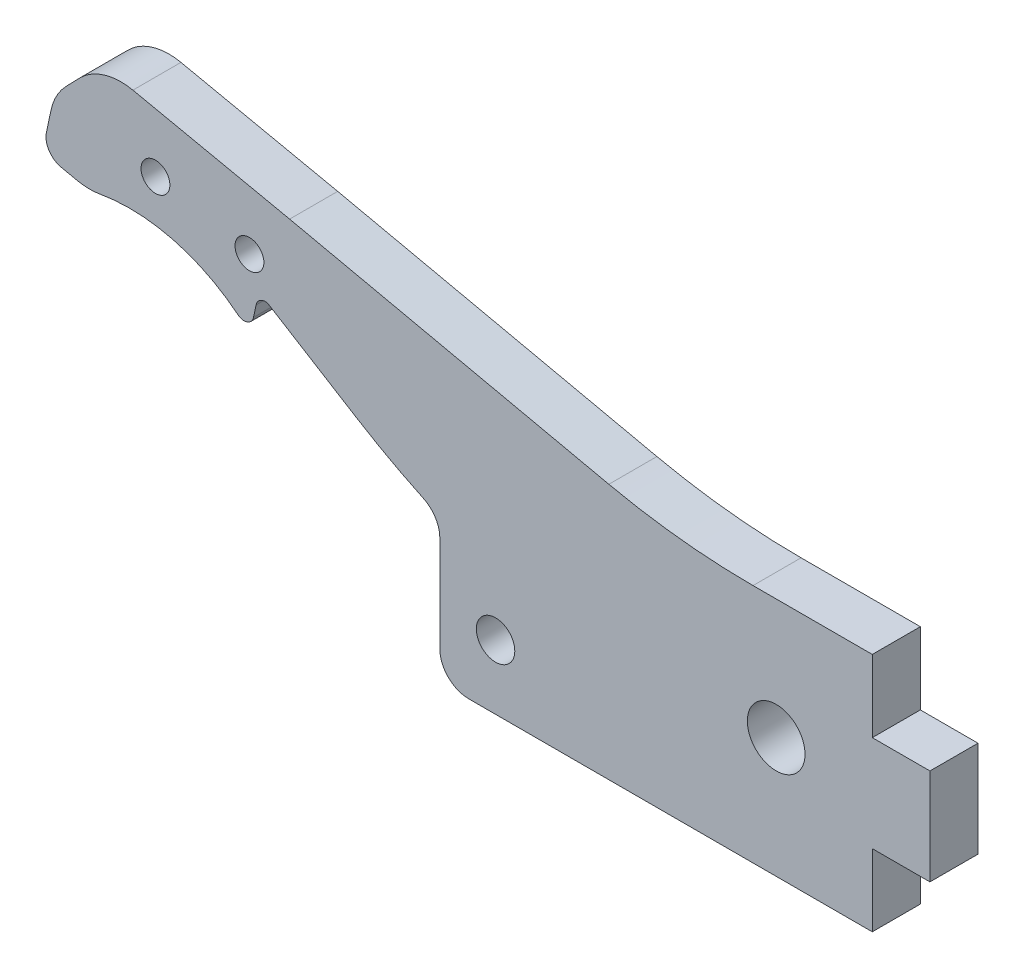
ISO-10303-21;
HEADER;
FILE_DESCRIPTION(('STEP AP214'),'2;1');
FILE_NAME('part.step','',(''),(''),'','','');
FILE_SCHEMA(('AUTOMOTIVE_DESIGN { 1 0 10303 214 1 1 1 1 }'));
ENDSEC;
DATA;
#1=APPLICATION_CONTEXT('core data for automotive mechanical design processes');
#2=APPLICATION_PROTOCOL_DEFINITION('international standard','automotive_design',2000,#1);
#3=PRODUCT_CONTEXT('',#1,'mechanical');
#4=PRODUCT('Part','Part','',(#3));
#5=PRODUCT_RELATED_PRODUCT_CATEGORY('part','',(#4));
#6=PRODUCT_DEFINITION_FORMATION('','',#4);
#7=PRODUCT_DEFINITION_CONTEXT('part definition',#1,'design');
#8=PRODUCT_DEFINITION('design','',#6,#7);
#9=PRODUCT_DEFINITION_SHAPE('','',#8);
#10=(LENGTH_UNIT() NAMED_UNIT(*) SI_UNIT(.MILLI.,.METRE.));
#11=(NAMED_UNIT(*) PLANE_ANGLE_UNIT() SI_UNIT($,.RADIAN.));
#12=(NAMED_UNIT(*) SI_UNIT($,.STERADIAN.) SOLID_ANGLE_UNIT());
#13=UNCERTAINTY_MEASURE_WITH_UNIT(LENGTH_MEASURE(1.E-05),#10,'distance_accuracy_value','');
#14=(GEOMETRIC_REPRESENTATION_CONTEXT(3) GLOBAL_UNCERTAINTY_ASSIGNED_CONTEXT((#13)) GLOBAL_UNIT_ASSIGNED_CONTEXT((#10,
#11,#12)) REPRESENTATION_CONTEXT('',''));
#15=CARTESIAN_POINT('',(0.,0.,0.));
#16=DIRECTION('',(0.,0.,1.));
#17=DIRECTION('',(1.,0.,0.));
#18=AXIS2_PLACEMENT_3D('',#15,#16,#17);
#19=CARTESIAN_POINT('',(-22.,-9.50000000000001,5.));
#20=DIRECTION('',(0.,0.,-1.));
#21=DIRECTION('',(-1.,0.,0.));
#22=AXIS2_PLACEMENT_3D('',#19,#20,#21);
#23=PLANE('',#22);
#24=DIRECTION('',(0.,1.,0.));
#25=VECTOR('',#24,1.);
#26=CARTESIAN_POINT('',(20.,12.5,5.));
#27=LINE('',#26,#25);
#28=CARTESIAN_POINT('',(20.0000000000001,5.,5.));
#29=VERTEX_POINT('',#28);
#30=CARTESIAN_POINT('',(20.,12.5,5.));
#31=VERTEX_POINT('',#30);
#32=EDGE_CURVE('E290',#29,#31,#27,.T.);
#33=ORIENTED_EDGE('',*,*,#32,.T.);
#34=DIRECTION('',(-1.,0.,0.));
#35=VECTOR('',#34,1.);
#36=CARTESIAN_POINT('',(7.58976539714363,12.5,5.));
#37=LINE('',#36,#35);
#38=CARTESIAN_POINT('',(7.58976539714363,12.5,5.));
#39=VERTEX_POINT('',#38);
#40=EDGE_CURVE('E147',#31,#39,#37,.T.);
#41=ORIENTED_EDGE('',*,*,#40,.T.);
#42=CARTESIAN_POINT('',(7.58976539714336,82.5,5.));
#43=DIRECTION('',(0.,0.,-1.));
#44=DIRECTION('',(-1.,0.,0.));
#45=AXIS2_PLACEMENT_3D('',#42,#43,#44);
#46=CIRCLE('',#45,70.);
#47=CARTESIAN_POINT('',(-7.41338790202135,14.1267201965434,5.));
#48=VERTEX_POINT('',#47);
#49=EDGE_CURVE('E359',#39,#48,#46,.T.);
#50=ORIENTED_EDGE('',*,*,#49,.T.);
#51=DIRECTION('',(-0.97676114004938,0.214330761416636,0.));
#52=VECTOR('',#51,1.);
#53=CARTESIAN_POINT('',(-40.6281021803242,21.4150271424409,5.));
#54=LINE('',#53,#52);
#55=CARTESIAN_POINT('',(-40.6281021803242,21.4150271424409,5.));
#56=VERTEX_POINT('',#55);
#57=EDGE_CURVE('E378',#48,#56,#54,.T.);
#58=ORIENTED_EDGE('',*,*,#57,.T.);
#59=DIRECTION('',(-0.978147600733806,0.20791169081776,0.));
#60=VECTOR('',#59,1.);
#61=CARTESIAN_POINT('',(-40.6281021803242,21.4150271424409,5.));
#62=LINE('',#61,#60);
#63=CARTESIAN_POINT('',(-56.9378777825389,24.8817769660573,5.));
#64=VERTEX_POINT('',#63);
#65=EDGE_CURVE('E375',#56,#64,#62,.T.);
#66=ORIENTED_EDGE('',*,*,#65,.T.);
#67=CARTESIAN_POINT('',(-58.1853479274455,19.0128913616545,5.));
#68=DIRECTION('',(0.,0.,1.));
#69=DIRECTION('',(1.,0.,0.));
#70=AXIS2_PLACEMENT_3D('',#67,#68,#69);
#71=CIRCLE('',#70,6.00000000000001);
#72=CARTESIAN_POINT('',(-62.5013867294774,23.1808415844084,5.));
#73=VERTEX_POINT('',#72);
#74=EDGE_CURVE('E377',#64,#73,#71,.T.);
#75=ORIENTED_EDGE('',*,*,#74,.T.);
#76=DIRECTION('',(-0.694658370458993,-0.719339800338656,0.));
#77=VECTOR('',#76,1.);
#78=CARTESIAN_POINT('',(-62.5013867294774,23.1808415844084,5.));
#79=LINE('',#78,#77);
#80=CARTESIAN_POINT('',(-63.9106705895129,21.7214854266059,5.));
#81=VERTEX_POINT('',#80);
#82=EDGE_CURVE('E380',#73,#81,#79,.T.);
#83=ORIENTED_EDGE('',*,*,#82,.T.);
#84=CARTESIAN_POINT('',(-59.594631787481,17.5535352038519,5.));
#85=DIRECTION('',(0.,0.,1.));
#86=DIRECTION('',(1.,0.,0.));
#87=AXIS2_PLACEMENT_3D('',#84,#85,#86);
#88=CIRCLE('',#87,6.00000000000001);
#89=CARTESIAN_POINT('',(-65.4635173918838,18.8010053487584,5.));
#90=VERTEX_POINT('',#89);
#91=EDGE_CURVE('E386',#81,#90,#88,.T.);
#92=ORIENTED_EDGE('',*,*,#91,.T.);
#93=DIRECTION('',(-0.207911690817756,-0.978147600733806,0.));
#94=VECTOR('',#93,1.);
#95=CARTESIAN_POINT('',(-65.4635173918839,18.8010053487584,5.));
#96=LINE('',#95,#94);
#97=CARTESIAN_POINT('',(-65.9374578472311,16.5712908124321,5.));
#98=VERTEX_POINT('',#97);
#99=EDGE_CURVE('E388',#90,#98,#96,.T.);
#100=ORIENTED_EDGE('',*,*,#99,.T.);
#101=CARTESIAN_POINT('',(-63.9811626457634,16.1554674307965,5.));
#102=DIRECTION('',(0.,0.,1.));
#103=DIRECTION('',(1.,0.,0.));
#104=AXIS2_PLACEMENT_3D('',#101,#102,#103);
#105=CIRCLE('',#104,2.00000000000001);
#106=CARTESIAN_POINT('',(-64.396986027399,14.1991722293289,5.));
#107=VERTEX_POINT('',#106);
#108=EDGE_CURVE('E390',#98,#107,#105,.T.);
#109=ORIENTED_EDGE('',*,*,#108,.T.);
#110=DIRECTION('',(0.978147600733806,-0.207911690817759,0.));
#111=VECTOR('',#110,1.);
#112=CARTESIAN_POINT('',(-64.396986027399,14.1991722293289,5.));
#113=LINE('',#112,#111);
#114=CARTESIAN_POINT('',(-62.6897231204534,13.8362822959618,5.));
#115=VERTEX_POINT('',#114);
#116=EDGE_CURVE('E392',#107,#115,#113,.T.);
#117=ORIENTED_EDGE('',*,*,#116,.T.);
#118=CARTESIAN_POINT('',(-61.4422529755468,19.7051679003646,5.));
#119=DIRECTION('',(0.,0.,1.));
#120=DIRECTION('',(1.,0.,0.));
#121=AXIS2_PLACEMENT_3D('',#118,#119,#120);
#122=CIRCLE('',#121,6.);
#123=CARTESIAN_POINT('',(-60.3987789043816,13.7966010806692,5.));
#124=VERTEX_POINT('',#123);
#125=EDGE_CURVE('E394',#115,#124,#122,.T.);
#126=ORIENTED_EDGE('',*,*,#125,.T.);
#127=CARTESIAN_POINT('',(-57.2683566908858,-3.92909937841711,5.));
#128=DIRECTION('',(0.,0.,-1.));
#129=DIRECTION('',(-1.,0.,0.));
#130=AXIS2_PLACEMENT_3D('',#127,#128,#129);
#131=CIRCLE('',#130,18.);
#132=CARTESIAN_POINT('',(-45.9931091820504,10.101894656736,5.));
#133=VERTEX_POINT('',#132);
#134=EDGE_CURVE('E396',#124,#133,#131,.T.);
#135=ORIENTED_EDGE('',*,*,#134,.T.);
#136=CARTESIAN_POINT('',(-45.3667065426706,10.8813943253556,5.));
#137=DIRECTION('',(0.,0.,1.));
#138=DIRECTION('',(-1.,0.,0.));
#139=AXIS2_PLACEMENT_3D('',#136,#137,#138);
#140=CIRCLE('',#139,1.);
#141=CARTESIAN_POINT('',(-44.3885589419368,10.6734826345378,5.));
#142=VERTEX_POINT('',#141);
#143=EDGE_CURVE('E398',#133,#142,#140,.T.);
#144=ORIENTED_EDGE('',*,*,#143,.T.);
#145=DIRECTION('',(0.207911690817757,0.978147600733806,0.));
#146=VECTOR('',#145,1.);
#147=CARTESIAN_POINT('',(-44.1206316886275,11.9339812576067,5.));
#148=LINE('',#147,#146);
#149=CARTESIAN_POINT('',(-44.1206316886275,11.9339812576067,5.));
#150=VERTEX_POINT('',#149);
#151=EDGE_CURVE('E400',#142,#150,#148,.T.);
#152=ORIENTED_EDGE('',*,*,#151,.T.);
#153=CARTESIAN_POINT('',(-43.1424840878937,11.7260695667889,5.));
#154=DIRECTION('',(0.,0.,-1.));
#155=DIRECTION('',(1.,0.,0.));
#156=AXIS2_PLACEMENT_3D('',#153,#154,#155);
#157=CIRCLE('',#156,1.);
#158=CARTESIAN_POINT('',(-42.9345723970759,12.7042171675227,5.));
#159=VERTEX_POINT('',#158);
#160=EDGE_CURVE('E402',#150,#159,#157,.T.);
#161=ORIENTED_EDGE('',*,*,#160,.T.);
#162=DIRECTION('',(0.851309274154006,-0.524664197119815,0.));
#163=VECTOR('',#162,1.);
#164=CARTESIAN_POINT('',(-42.9345723970759,12.7042171675227,5.));
#165=LINE('',#164,#163);
#166=CARTESIAN_POINT('',(-33.5196945654434,6.90180261797671,5.));
#167=VERTEX_POINT('',#166);
#168=EDGE_CURVE('E404',#159,#167,#165,.T.);
#169=ORIENTED_EDGE('',*,*,#168,.T.);
#170=CARTESIAN_POINT('',(3.20679923294368,66.4934518087571,5.));
#171=DIRECTION('',(0.,0.,1.));
#172=DIRECTION('',(1.,0.,0.));
#173=AXIS2_PLACEMENT_3D('',#170,#171,#172);
#174=CIRCLE('',#173,70.);
#175=CARTESIAN_POINT('',(-26.7175287986461,3.21205966337358,5.));
#176=VERTEX_POINT('',#175);
#177=EDGE_CURVE('E406',#167,#176,#174,.T.);
#178=ORIENTED_EDGE('',*,*,#177,.T.);
#179=CARTESIAN_POINT('',(-28.,0.499999999999994,5.));
#180=DIRECTION('',(0.,0.,-1.));
#181=DIRECTION('',(1.,0.,0.));
#182=AXIS2_PLACEMENT_3D('',#179,#180,#181);
#183=CIRCLE('',#182,3.);
#184=CARTESIAN_POINT('',(-25.,0.499999999999994,5.));
#185=VERTEX_POINT('',#184);
#186=EDGE_CURVE('E408',#176,#185,#183,.T.);
#187=ORIENTED_EDGE('',*,*,#186,.T.);
#188=DIRECTION('',(0.,-1.,0.));
#189=VECTOR('',#188,1.);
#190=CARTESIAN_POINT('',(-25.,-9.49999999999998,5.));
#191=LINE('',#190,#189);
#192=CARTESIAN_POINT('',(-25.,-9.49999999999998,5.));
#193=VERTEX_POINT('',#192);
#194=EDGE_CURVE('E410',#185,#193,#191,.T.);
#195=ORIENTED_EDGE('',*,*,#194,.T.);
#196=CARTESIAN_POINT('',(-22.,-9.50000000000001,5.));
#197=DIRECTION('',(0.,0.,1.));
#198=DIRECTION('',(-1.,0.,0.));
#199=AXIS2_PLACEMENT_3D('',#196,#197,#198);
#200=CIRCLE('',#199,3.);
#201=CARTESIAN_POINT('',(-22.,-12.5,5.));
#202=VERTEX_POINT('',#201);
#203=EDGE_CURVE('E412',#193,#202,#200,.T.);
#204=ORIENTED_EDGE('',*,*,#203,.T.);
#205=DIRECTION('',(1.,0.,0.));
#206=VECTOR('',#205,1.);
#207=CARTESIAN_POINT('',(0.,-12.5,5.));
#208=LINE('',#207,#206);
#209=CARTESIAN_POINT('',(20.,-12.5,5.));
#210=VERTEX_POINT('',#209);
#211=EDGE_CURVE('E414',#202,#210,#208,.T.);
#212=ORIENTED_EDGE('',*,*,#211,.T.);
#213=DIRECTION('',(0.,1.,0.));
#214=VECTOR('',#213,1.);
#215=CARTESIAN_POINT('',(20.,-5.,5.));
#216=LINE('',#215,#214);
#217=CARTESIAN_POINT('',(20.,-5.,5.));
#218=VERTEX_POINT('',#217);
#219=EDGE_CURVE('E220',#210,#218,#216,.T.);
#220=ORIENTED_EDGE('',*,*,#219,.T.);
#221=DIRECTION('',(1.,0.,0.));
#222=VECTOR('',#221,1.);
#223=CARTESIAN_POINT('',(20.,-5.,5.));
#224=LINE('',#223,#222);
#225=CARTESIAN_POINT('',(26.0000000000001,-5.,5.));
#226=VERTEX_POINT('',#225);
#227=EDGE_CURVE('E214',#218,#226,#224,.T.);
#228=ORIENTED_EDGE('',*,*,#227,.T.);
#229=DIRECTION('',(0.,1.,0.));
#230=VECTOR('',#229,1.);
#231=CARTESIAN_POINT('',(26.0000000000001,5.,5.));
#232=LINE('',#231,#230);
#233=CARTESIAN_POINT('',(26.0000000000001,5.,5.));
#234=VERTEX_POINT('',#233);
#235=EDGE_CURVE('E218',#226,#234,#232,.T.);
#236=ORIENTED_EDGE('',*,*,#235,.T.);
#237=DIRECTION('',(-1.,0.,0.));
#238=VECTOR('',#237,1.);
#239=CARTESIAN_POINT('',(20.0000000000001,5.,5.));
#240=LINE('',#239,#238);
#241=EDGE_CURVE('E50',#234,#29,#240,.T.);
#242=ORIENTED_EDGE('',*,*,#241,.T.);
#243=EDGE_LOOP('',(#33,#41,#50,#58,#66,#75,#83,#92,#100,#109,#117,#126,#135,#144,#152,#161,#169,
#178,#187,#195,#204,#212,#220,#228,#236,#242));
#244=FACE_BOUND('',#243,.T.);
#245=CARTESIAN_POINT('',(10.,0.,5.));
#246=DIRECTION('',(0.,0.,1.));
#247=DIRECTION('',(1.,0.,0.));
#248=AXIS2_PLACEMENT_3D('',#245,#246,#247);
#249=CIRCLE('',#248,2.99999999999999);
#250=CARTESIAN_POINT('',(13.,0.,5.));
#251=VERTEX_POINT('',#250);
#252=EDGE_CURVE('E242',#251,#251,#249,.T.);
#253=ORIENTED_EDGE('',*,*,#252,.F.);
#254=EDGE_LOOP('',(#253));
#255=FACE_BOUND('',#254,.T.);
#256=CARTESIAN_POINT('',(-19.2,-5.8,5.));
#257=DIRECTION('',(0.,0.,1.));
#258=DIRECTION('',(1.,0.,0.));
#259=AXIS2_PLACEMENT_3D('',#256,#257,#258);
#260=CIRCLE('',#259,2.);
#261=CARTESIAN_POINT('',(-17.2,-5.8,5.));
#262=VERTEX_POINT('',#261);
#263=EDGE_CURVE('E477',#262,#262,#260,.T.);
#264=ORIENTED_EDGE('',*,*,#263,.F.);
#265=EDGE_LOOP('',(#264));
#266=FACE_BOUND('',#265,.T.);
#267=CARTESIAN_POINT('',(-54.5907243760716,18.2488305390763,5.));
#268=DIRECTION('',(0.,0.,1.));
#269=DIRECTION('',(1.,0.,0.));
#270=AXIS2_PLACEMENT_3D('',#267,#268,#269);
#271=CIRCLE('',#270,1.5);
#272=CARTESIAN_POINT('',(-53.0907243760716,18.2488305390763,5.));
#273=VERTEX_POINT('',#272);
#274=EDGE_CURVE('E471',#273,#273,#271,.T.);
#275=ORIENTED_EDGE('',*,*,#274,.F.);
#276=EDGE_LOOP('',(#275));
#277=FACE_BOUND('',#276,.T.);
#278=CARTESIAN_POINT('',(-44.8092483687335,16.1697136308987,5.));
#279=DIRECTION('',(0.,0.,1.));
#280=DIRECTION('',(1.,0.,0.));
#281=AXIS2_PLACEMENT_3D('',#278,#279,#280);
#282=CIRCLE('',#281,1.5);
#283=CARTESIAN_POINT('',(-43.3092483687335,16.1697136308987,5.));
#284=VERTEX_POINT('',#283);
#285=EDGE_CURVE('E462',#284,#284,#282,.T.);
#286=ORIENTED_EDGE('',*,*,#285,.F.);
#287=EDGE_LOOP('',(#286));
#288=FACE_BOUND('',#287,.T.);
#289=ADVANCED_FACE('F33',(#244,#255,#266,#277,#288),#23,.F.);
#290=CARTESIAN_POINT('',(-22.,-9.50000000000001,0.));
#291=DIRECTION('',(0.,0.,-1.));
#292=DIRECTION('',(-1.,0.,0.));
#293=AXIS2_PLACEMENT_3D('',#290,#291,#292);
#294=PLANE('',#293);
#295=CARTESIAN_POINT('',(-54.5907243760716,18.2488305390763,0.));
#296=DIRECTION('',(0.,0.,1.));
#297=DIRECTION('',(1.,0.,0.));
#298=AXIS2_PLACEMENT_3D('',#295,#296,#297);
#299=CIRCLE('',#298,1.5);
#300=CARTESIAN_POINT('',(-53.0907243760716,18.2488305390763,0.));
#301=VERTEX_POINT('',#300);
#302=EDGE_CURVE('E468',#301,#301,#299,.T.);
#303=ORIENTED_EDGE('',*,*,#302,.T.);
#304=EDGE_LOOP('',(#303));
#305=FACE_BOUND('',#304,.T.);
#306=CARTESIAN_POINT('',(10.,0.,0.));
#307=DIRECTION('',(0.,0.,1.));
#308=DIRECTION('',(1.,0.,0.));
#309=AXIS2_PLACEMENT_3D('',#306,#307,#308);
#310=CIRCLE('',#309,2.99999999999999);
#311=CARTESIAN_POINT('',(13.,0.,0.));
#312=VERTEX_POINT('',#311);
#313=EDGE_CURVE('E480',#312,#312,#310,.T.);
#314=ORIENTED_EDGE('',*,*,#313,.T.);
#315=EDGE_LOOP('',(#314));
#316=FACE_BOUND('',#315,.T.);
#317=DIRECTION('',(0.,1.,0.));
#318=VECTOR('',#317,1.);
#319=CARTESIAN_POINT('',(20.,12.5,0.));
#320=LINE('',#319,#318);
#321=CARTESIAN_POINT('',(20.0000000000001,5.,0.));
#322=VERTEX_POINT('',#321);
#323=CARTESIAN_POINT('',(20.,12.5,0.));
#324=VERTEX_POINT('',#323);
#325=EDGE_CURVE('E238',#322,#324,#320,.T.);
#326=ORIENTED_EDGE('',*,*,#325,.F.);
#327=DIRECTION('',(-1.,0.,0.));
#328=VECTOR('',#327,1.);
#329=CARTESIAN_POINT('',(20.0000000000001,5.,0.));
#330=LINE('',#329,#328);
#331=CARTESIAN_POINT('',(26.0000000000001,5.,0.));
#332=VERTEX_POINT('',#331);
#333=EDGE_CURVE('E139',#332,#322,#330,.T.);
#334=ORIENTED_EDGE('',*,*,#333,.F.);
#335=DIRECTION('',(0.,1.,0.));
#336=VECTOR('',#335,1.);
#337=CARTESIAN_POINT('',(26.0000000000001,5.,0.));
#338=LINE('',#337,#336);
#339=CARTESIAN_POINT('',(26.0000000000001,-5.,0.));
#340=VERTEX_POINT('',#339);
#341=EDGE_CURVE('E133',#340,#332,#338,.T.);
#342=ORIENTED_EDGE('',*,*,#341,.F.);
#343=DIRECTION('',(1.,0.,0.));
#344=VECTOR('',#343,1.);
#345=CARTESIAN_POINT('',(20.,-5.,0.));
#346=LINE('',#345,#344);
#347=CARTESIAN_POINT('',(20.,-5.,0.));
#348=VERTEX_POINT('',#347);
#349=EDGE_CURVE('E228',#348,#340,#346,.T.);
#350=ORIENTED_EDGE('',*,*,#349,.F.);
#351=DIRECTION('',(0.,1.,0.));
#352=VECTOR('',#351,1.);
#353=CARTESIAN_POINT('',(20.,-5.,0.));
#354=LINE('',#353,#352);
#355=CARTESIAN_POINT('',(20.,-12.5,0.));
#356=VERTEX_POINT('',#355);
#357=EDGE_CURVE('E285',#356,#348,#354,.T.);
#358=ORIENTED_EDGE('',*,*,#357,.F.);
#359=DIRECTION('',(1.,0.,0.));
#360=VECTOR('',#359,1.);
#361=CARTESIAN_POINT('',(0.,-12.5,0.));
#362=LINE('',#361,#360);
#363=CARTESIAN_POINT('',(-22.,-12.5,0.));
#364=VERTEX_POINT('',#363);
#365=EDGE_CURVE('E283',#364,#356,#362,.T.);
#366=ORIENTED_EDGE('',*,*,#365,.F.);
#367=CARTESIAN_POINT('',(-22.,-9.50000000000001,0.));
#368=DIRECTION('',(0.,0.,1.));
#369=DIRECTION('',(-1.,0.,0.));
#370=AXIS2_PLACEMENT_3D('',#367,#368,#369);
#371=CIRCLE('',#370,3.);
#372=CARTESIAN_POINT('',(-25.,-9.49999999999998,0.));
#373=VERTEX_POINT('',#372);
#374=EDGE_CURVE('E280',#373,#364,#371,.T.);
#375=ORIENTED_EDGE('',*,*,#374,.F.);
#376=DIRECTION('',(0.,-1.,0.));
#377=VECTOR('',#376,1.);
#378=CARTESIAN_POINT('',(-25.,-9.49999999999998,0.));
#379=LINE('',#378,#377);
#380=CARTESIAN_POINT('',(-25.,0.499999999999994,0.));
#381=VERTEX_POINT('',#380);
#382=EDGE_CURVE('E278',#381,#373,#379,.T.);
#383=ORIENTED_EDGE('',*,*,#382,.F.);
#384=CARTESIAN_POINT('',(-28.,0.499999999999994,0.));
#385=DIRECTION('',(0.,0.,-1.));
#386=DIRECTION('',(1.,0.,0.));
#387=AXIS2_PLACEMENT_3D('',#384,#385,#386);
#388=CIRCLE('',#387,3.);
#389=CARTESIAN_POINT('',(-26.7175287986461,3.21205966337358,0.));
#390=VERTEX_POINT('',#389);
#391=EDGE_CURVE('E276',#390,#381,#388,.T.);
#392=ORIENTED_EDGE('',*,*,#391,.F.);
#393=CARTESIAN_POINT('',(3.20679923294368,66.4934518087571,0.));
#394=DIRECTION('',(0.,0.,1.));
#395=DIRECTION('',(1.,0.,0.));
#396=AXIS2_PLACEMENT_3D('',#393,#394,#395);
#397=CIRCLE('',#396,70.);
#398=CARTESIAN_POINT('',(-33.5196945654434,6.90180261797671,0.));
#399=VERTEX_POINT('',#398);
#400=EDGE_CURVE('E274',#399,#390,#397,.T.);
#401=ORIENTED_EDGE('',*,*,#400,.F.);
#402=DIRECTION('',(0.851309274154006,-0.524664197119815,0.));
#403=VECTOR('',#402,1.);
#404=CARTESIAN_POINT('',(-42.9345723970759,12.7042171675227,0.));
#405=LINE('',#404,#403);
#406=CARTESIAN_POINT('',(-42.9345723970759,12.7042171675227,0.));
#407=VERTEX_POINT('',#406);
#408=EDGE_CURVE('E272',#407,#399,#405,.T.);
#409=ORIENTED_EDGE('',*,*,#408,.F.);
#410=CARTESIAN_POINT('',(-43.1424840878937,11.7260695667889,0.));
#411=DIRECTION('',(0.,0.,-1.));
#412=DIRECTION('',(1.,0.,0.));
#413=AXIS2_PLACEMENT_3D('',#410,#411,#412);
#414=CIRCLE('',#413,1.);
#415=CARTESIAN_POINT('',(-44.1206316886275,11.9339812576067,0.));
#416=VERTEX_POINT('',#415);
#417=EDGE_CURVE('E270',#416,#407,#414,.T.);
#418=ORIENTED_EDGE('',*,*,#417,.F.);
#419=DIRECTION('',(0.207911690817757,0.978147600733806,0.));
#420=VECTOR('',#419,1.);
#421=CARTESIAN_POINT('',(-44.1206316886275,11.9339812576067,0.));
#422=LINE('',#421,#420);
#423=CARTESIAN_POINT('',(-44.3885589419368,10.6734826345378,0.));
#424=VERTEX_POINT('',#423);
#425=EDGE_CURVE('E268',#424,#416,#422,.T.);
#426=ORIENTED_EDGE('',*,*,#425,.F.);
#427=CARTESIAN_POINT('',(-45.3667065426706,10.8813943253556,0.));
#428=DIRECTION('',(0.,0.,1.));
#429=DIRECTION('',(-1.,0.,0.));
#430=AXIS2_PLACEMENT_3D('',#427,#428,#429);
#431=CIRCLE('',#430,1.);
#432=CARTESIAN_POINT('',(-45.9931091820504,10.101894656736,0.));
#433=VERTEX_POINT('',#432);
#434=EDGE_CURVE('E266',#433,#424,#431,.T.);
#435=ORIENTED_EDGE('',*,*,#434,.F.);
#436=CARTESIAN_POINT('',(-57.2683566908858,-3.92909937841711,0.));
#437=DIRECTION('',(0.,0.,-1.));
#438=DIRECTION('',(-1.,0.,0.));
#439=AXIS2_PLACEMENT_3D('',#436,#437,#438);
#440=CIRCLE('',#439,18.);
#441=CARTESIAN_POINT('',(-60.3987789043816,13.7966010806692,0.));
#442=VERTEX_POINT('',#441);
#443=EDGE_CURVE('E264',#442,#433,#440,.T.);
#444=ORIENTED_EDGE('',*,*,#443,.F.);
#445=CARTESIAN_POINT('',(-61.4422529755468,19.7051679003646,0.));
#446=DIRECTION('',(0.,0.,1.));
#447=DIRECTION('',(1.,0.,0.));
#448=AXIS2_PLACEMENT_3D('',#445,#446,#447);
#449=CIRCLE('',#448,6.);
#450=CARTESIAN_POINT('',(-62.6897231204534,13.8362822959618,0.));
#451=VERTEX_POINT('',#450);
#452=EDGE_CURVE('E262',#451,#442,#449,.T.);
#453=ORIENTED_EDGE('',*,*,#452,.F.);
#454=DIRECTION('',(0.978147600733806,-0.207911690817759,0.));
#455=VECTOR('',#454,1.);
#456=CARTESIAN_POINT('',(-64.396986027399,14.1991722293289,0.));
#457=LINE('',#456,#455);
#458=CARTESIAN_POINT('',(-64.396986027399,14.1991722293289,0.));
#459=VERTEX_POINT('',#458);
#460=EDGE_CURVE('E260',#459,#451,#457,.T.);
#461=ORIENTED_EDGE('',*,*,#460,.F.);
#462=CARTESIAN_POINT('',(-63.9811626457634,16.1554674307965,0.));
#463=DIRECTION('',(0.,0.,1.));
#464=DIRECTION('',(1.,0.,0.));
#465=AXIS2_PLACEMENT_3D('',#462,#463,#464);
#466=CIRCLE('',#465,2.00000000000001);
#467=CARTESIAN_POINT('',(-65.9374578472311,16.5712908124321,0.));
#468=VERTEX_POINT('',#467);
#469=EDGE_CURVE('E258',#468,#459,#466,.T.);
#470=ORIENTED_EDGE('',*,*,#469,.F.);
#471=DIRECTION('',(-0.207911690817756,-0.978147600733806,0.));
#472=VECTOR('',#471,1.);
#473=CARTESIAN_POINT('',(-65.4635173918839,18.8010053487584,0.));
#474=LINE('',#473,#472);
#475=CARTESIAN_POINT('',(-65.4635173918838,18.8010053487584,0.));
#476=VERTEX_POINT('',#475);
#477=EDGE_CURVE('E256',#476,#468,#474,.T.);
#478=ORIENTED_EDGE('',*,*,#477,.F.);
#479=CARTESIAN_POINT('',(-59.594631787481,17.5535352038519,0.));
#480=DIRECTION('',(0.,0.,1.));
#481=DIRECTION('',(1.,0.,0.));
#482=AXIS2_PLACEMENT_3D('',#479,#480,#481);
#483=CIRCLE('',#482,6.00000000000001);
#484=CARTESIAN_POINT('',(-63.9106705895129,21.7214854266059,0.));
#485=VERTEX_POINT('',#484);
#486=EDGE_CURVE('E254',#485,#476,#483,.T.);
#487=ORIENTED_EDGE('',*,*,#486,.F.);
#488=DIRECTION('',(-0.694658370458993,-0.719339800338656,0.));
#489=VECTOR('',#488,1.);
#490=CARTESIAN_POINT('',(-62.5013867294774,23.1808415844084,0.));
#491=LINE('',#490,#489);
#492=CARTESIAN_POINT('',(-62.5013867294774,23.1808415844084,0.));
#493=VERTEX_POINT('',#492);
#494=EDGE_CURVE('E252',#493,#485,#491,.T.);
#495=ORIENTED_EDGE('',*,*,#494,.F.);
#496=CARTESIAN_POINT('',(-58.1853479274455,19.0128913616545,0.));
#497=DIRECTION('',(0.,0.,1.));
#498=DIRECTION('',(1.,0.,0.));
#499=AXIS2_PLACEMENT_3D('',#496,#497,#498);
#500=CIRCLE('',#499,6.00000000000001);
#501=CARTESIAN_POINT('',(-56.9378777825389,24.8817769660573,0.));
#502=VERTEX_POINT('',#501);
#503=EDGE_CURVE('E250',#502,#493,#500,.T.);
#504=ORIENTED_EDGE('',*,*,#503,.F.);
#505=DIRECTION('',(-0.978147600733806,0.20791169081776,0.));
#506=VECTOR('',#505,1.);
#507=CARTESIAN_POINT('',(-40.6281021803242,21.4150271424409,0.));
#508=LINE('',#507,#506);
#509=CARTESIAN_POINT('',(-40.6281021803242,21.4150271424409,0.));
#510=VERTEX_POINT('',#509);
#511=EDGE_CURVE('E248',#510,#502,#508,.T.);
#512=ORIENTED_EDGE('',*,*,#511,.F.);
#513=DIRECTION('',(-0.97676114004938,0.214330761416636,0.));
#514=VECTOR('',#513,1.);
#515=CARTESIAN_POINT('',(-40.6281021803242,21.4150271424409,0.));
#516=LINE('',#515,#514);
#517=CARTESIAN_POINT('',(-7.41338790202135,14.1267201965434,0.));
#518=VERTEX_POINT('',#517);
#519=EDGE_CURVE('E246',#518,#510,#516,.T.);
#520=ORIENTED_EDGE('',*,*,#519,.F.);
#521=CARTESIAN_POINT('',(7.58976539714336,82.5,0.));
#522=DIRECTION('',(0.,0.,-1.));
#523=DIRECTION('',(-1.,0.,0.));
#524=AXIS2_PLACEMENT_3D('',#521,#522,#523);
#525=CIRCLE('',#524,70.);
#526=CARTESIAN_POINT('',(7.58976539714363,12.5,0.));
#527=VERTEX_POINT('',#526);
#528=EDGE_CURVE('E244',#527,#518,#525,.T.);
#529=ORIENTED_EDGE('',*,*,#528,.F.);
#530=DIRECTION('',(-1.,0.,0.));
#531=VECTOR('',#530,1.);
#532=CARTESIAN_POINT('',(7.58976539714363,12.5,0.));
#533=LINE('',#532,#531);
#534=EDGE_CURVE('E241',#324,#527,#533,.T.);
#535=ORIENTED_EDGE('',*,*,#534,.F.);
#536=EDGE_LOOP('',(#326,#334,#342,#350,#358,#366,#375,#383,#392,#401,#409,#418,#426,#435,#444,
#453,#461,#470,#478,#487,#495,#504,#512,#520,#529,#535));
#537=FACE_BOUND('',#536,.T.);
#538=CARTESIAN_POINT('',(-19.2,-5.8,0.));
#539=DIRECTION('',(0.,0.,1.));
#540=DIRECTION('',(1.,0.,0.));
#541=AXIS2_PLACEMENT_3D('',#538,#539,#540);
#542=CIRCLE('',#541,2.);
#543=CARTESIAN_POINT('',(-17.2,-5.8,0.));
#544=VERTEX_POINT('',#543);
#545=EDGE_CURVE('E474',#544,#544,#542,.T.);
#546=ORIENTED_EDGE('',*,*,#545,.T.);
#547=EDGE_LOOP('',(#546));
#548=FACE_BOUND('',#547,.T.);
#549=CARTESIAN_POINT('',(-44.8092483687335,16.1697136308987,0.));
#550=DIRECTION('',(0.,0.,1.));
#551=DIRECTION('',(1.,0.,0.));
#552=AXIS2_PLACEMENT_3D('',#549,#550,#551);
#553=CIRCLE('',#552,1.5);
#554=CARTESIAN_POINT('',(-43.3092483687335,16.1697136308987,0.));
#555=VERTEX_POINT('',#554);
#556=EDGE_CURVE('E465',#555,#555,#553,.T.);
#557=ORIENTED_EDGE('',*,*,#556,.T.);
#558=EDGE_LOOP('',(#557));
#559=FACE_BOUND('',#558,.T.);
#560=ADVANCED_FACE('F363',(#305,#316,#537,#548,#559),#294,.T.);
#561=CARTESIAN_POINT('',(20.,12.5,5.));
#562=DIRECTION('',(-1.,0.,0.));
#563=DIRECTION('',(0.,-1.,0.));
#564=AXIS2_PLACEMENT_3D('',#561,#562,#563);
#565=PLANE('',#564);
#566=ORIENTED_EDGE('',*,*,#325,.T.);
#567=DIRECTION('',(0.,0.,-1.));
#568=VECTOR('',#567,1.);
#569=CARTESIAN_POINT('',(20.,12.5,5.));
#570=LINE('',#569,#568);
#571=EDGE_CURVE('E11',#31,#324,#570,.T.);
#572=ORIENTED_EDGE('',*,*,#571,.F.);
#573=ORIENTED_EDGE('',*,*,#32,.F.);
#574=DIRECTION('',(0.,0.,-1.));
#575=VECTOR('',#574,1.);
#576=CARTESIAN_POINT('',(20.0000000000001,5.,5.));
#577=LINE('',#576,#575);
#578=EDGE_CURVE('E234',#29,#322,#577,.T.);
#579=ORIENTED_EDGE('',*,*,#578,.T.);
#580=EDGE_LOOP('',(#566,#572,#573,#579));
#581=FACE_BOUND('',#580,.T.);
#582=ADVANCED_FACE('F35',(#581),#565,.F.);
#583=CARTESIAN_POINT('',(7.58976539714363,12.5,5.));
#584=DIRECTION('',(0.,-1.,0.));
#585=DIRECTION('',(0.,0.,-1.));
#586=AXIS2_PLACEMENT_3D('',#583,#584,#585);
#587=PLANE('',#586);
#588=ORIENTED_EDGE('',*,*,#534,.T.);
#589=DIRECTION('',(0.,0.,-1.));
#590=VECTOR('',#589,1.);
#591=CARTESIAN_POINT('',(7.58976539714363,12.5,5.));
#592=LINE('',#591,#590);
#593=EDGE_CURVE('E42',#39,#527,#592,.T.);
#594=ORIENTED_EDGE('',*,*,#593,.F.);
#595=ORIENTED_EDGE('',*,*,#40,.F.);
#596=ORIENTED_EDGE('',*,*,#571,.T.);
#597=EDGE_LOOP('',(#588,#594,#595,#596));
#598=FACE_BOUND('',#597,.T.);
#599=ADVANCED_FACE('F733',(#598),#587,.F.);
#600=CARTESIAN_POINT('',(7.58976539714336,82.5,5.));
#601=DIRECTION('',(0.,0.,-1.));
#602=DIRECTION('',(-1.,0.,0.));
#603=AXIS2_PLACEMENT_3D('',#600,#601,#602);
#604=CYLINDRICAL_SURFACE('',#603,70.);
#605=ORIENTED_EDGE('',*,*,#528,.T.);
#606=DIRECTION('',(0.,0.,-1.));
#607=VECTOR('',#606,1.);
#608=CARTESIAN_POINT('',(-7.41338790202135,14.1267201965434,5.));
#609=LINE('',#608,#607);
#610=EDGE_CURVE('E351',#48,#518,#609,.T.);
#611=ORIENTED_EDGE('',*,*,#610,.F.);
#612=ORIENTED_EDGE('',*,*,#49,.F.);
#613=ORIENTED_EDGE('',*,*,#593,.T.);
#614=EDGE_LOOP('',(#605,#611,#612,#613));
#615=FACE_BOUND('',#614,.T.);
#616=ADVANCED_FACE('F357',(#615),#604,.F.);
#617=CARTESIAN_POINT('',(-40.6281021803242,21.4150271424409,5.));
#618=DIRECTION('',(-0.214330761416636,-0.97676114004938,0.));
#619=DIRECTION('',(0.97676114004938,-0.214330761416636,0.));
#620=AXIS2_PLACEMENT_3D('',#617,#618,#619);
#621=PLANE('',#620);
#622=ORIENTED_EDGE('',*,*,#519,.T.);
#623=DIRECTION('',(0.,0.,-1.));
#624=VECTOR('',#623,1.);
#625=CARTESIAN_POINT('',(-40.6281021803242,21.4150271424409,5.));
#626=LINE('',#625,#624);
#627=EDGE_CURVE('E348',#56,#510,#626,.T.);
#628=ORIENTED_EDGE('',*,*,#627,.F.);
#629=ORIENTED_EDGE('',*,*,#57,.F.);
#630=ORIENTED_EDGE('',*,*,#610,.T.);
#631=EDGE_LOOP('',(#622,#628,#629,#630));
#632=FACE_BOUND('',#631,.T.);
#633=ADVANCED_FACE('F369',(#632),#621,.F.);
#634=CARTESIAN_POINT('',(-40.6281021803242,21.4150271424409,5.));
#635=DIRECTION('',(-0.20791169081776,-0.978147600733806,0.));
#636=DIRECTION('',(0.978147600733806,-0.20791169081776,0.));
#637=AXIS2_PLACEMENT_3D('',#634,#635,#636);
#638=PLANE('',#637);
#639=ORIENTED_EDGE('',*,*,#511,.T.);
#640=DIRECTION('',(0.,0.,-1.));
#641=VECTOR('',#640,1.);
#642=CARTESIAN_POINT('',(-56.9378777825389,24.8817769660573,5.));
#643=LINE('',#642,#641);
#644=EDGE_CURVE('E345',#64,#502,#643,.T.);
#645=ORIENTED_EDGE('',*,*,#644,.F.);
#646=ORIENTED_EDGE('',*,*,#65,.F.);
#647=ORIENTED_EDGE('',*,*,#627,.T.);
#648=EDGE_LOOP('',(#639,#645,#646,#647));
#649=FACE_BOUND('',#648,.T.);
#650=ADVANCED_FACE('F373',(#649),#638,.F.);
#651=CARTESIAN_POINT('',(-58.1853479274455,19.0128913616545,5.));
#652=DIRECTION('',(0.,0.,-1.));
#653=DIRECTION('',(-1.,0.,0.));
#654=AXIS2_PLACEMENT_3D('',#651,#652,#653);
#655=CYLINDRICAL_SURFACE('',#654,6.00000000000001);
#656=ORIENTED_EDGE('',*,*,#503,.T.);
#657=DIRECTION('',(0.,0.,-1.));
#658=VECTOR('',#657,1.);
#659=CARTESIAN_POINT('',(-62.5013867294774,23.1808415844084,5.));
#660=LINE('',#659,#658);
#661=EDGE_CURVE('E342',#73,#493,#660,.T.);
#662=ORIENTED_EDGE('',*,*,#661,.F.);
#663=ORIENTED_EDGE('',*,*,#74,.F.);
#664=ORIENTED_EDGE('',*,*,#644,.T.);
#665=EDGE_LOOP('',(#656,#662,#663,#664));
#666=FACE_BOUND('',#665,.T.);
#667=ADVANCED_FACE('F698',(#666),#655,.T.);
#668=CARTESIAN_POINT('',(-62.5013867294774,23.1808415844084,5.));
#669=DIRECTION('',(0.719339800338656,-0.694658370458993,0.));
#670=DIRECTION('',(0.694658370458993,0.719339800338656,0.));
#671=AXIS2_PLACEMENT_3D('',#668,#669,#670);
#672=PLANE('',#671);
#673=ORIENTED_EDGE('',*,*,#494,.T.);
#674=DIRECTION('',(0.,0.,-1.));
#675=VECTOR('',#674,1.);
#676=CARTESIAN_POINT('',(-63.9106705895129,21.7214854266059,5.));
#677=LINE('',#676,#675);
#678=EDGE_CURVE('E339',#81,#485,#677,.T.);
#679=ORIENTED_EDGE('',*,*,#678,.F.);
#680=ORIENTED_EDGE('',*,*,#82,.F.);
#681=ORIENTED_EDGE('',*,*,#661,.T.);
#682=EDGE_LOOP('',(#673,#679,#680,#681));
#683=FACE_BOUND('',#682,.T.);
#684=ADVANCED_FACE('F688',(#683),#672,.F.);
#685=CARTESIAN_POINT('',(-59.594631787481,17.5535352038519,5.));
#686=DIRECTION('',(0.,0.,-1.));
#687=DIRECTION('',(-1.,0.,0.));
#688=AXIS2_PLACEMENT_3D('',#685,#686,#687);
#689=CYLINDRICAL_SURFACE('',#688,6.00000000000001);
#690=ORIENTED_EDGE('',*,*,#486,.T.);
#691=DIRECTION('',(0.,0.,-1.));
#692=VECTOR('',#691,1.);
#693=CARTESIAN_POINT('',(-65.4635173918838,18.8010053487584,5.));
#694=LINE('',#693,#692);
#695=EDGE_CURVE('E336',#90,#476,#694,.T.);
#696=ORIENTED_EDGE('',*,*,#695,.F.);
#697=ORIENTED_EDGE('',*,*,#91,.F.);
#698=ORIENTED_EDGE('',*,*,#678,.T.);
#699=EDGE_LOOP('',(#690,#696,#697,#698));
#700=FACE_BOUND('',#699,.T.);
#701=ADVANCED_FACE('F678',(#700),#689,.T.);
#702=CARTESIAN_POINT('',(-65.4635173918839,18.8010053487584,5.));
#703=DIRECTION('',(0.978147600733806,-0.207911690817756,0.));
#704=DIRECTION('',(0.207911690817756,0.978147600733806,0.));
#705=AXIS2_PLACEMENT_3D('',#702,#703,#704);
#706=PLANE('',#705);
#707=ORIENTED_EDGE('',*,*,#477,.T.);
#708=DIRECTION('',(0.,0.,-1.));
#709=VECTOR('',#708,1.);
#710=CARTESIAN_POINT('',(-65.9374578472311,16.5712908124321,5.));
#711=LINE('',#710,#709);
#712=EDGE_CURVE('E333',#98,#468,#711,.T.);
#713=ORIENTED_EDGE('',*,*,#712,.F.);
#714=ORIENTED_EDGE('',*,*,#99,.F.);
#715=ORIENTED_EDGE('',*,*,#695,.T.);
#716=EDGE_LOOP('',(#707,#713,#714,#715));
#717=FACE_BOUND('',#716,.T.);
#718=ADVANCED_FACE('F668',(#717),#706,.F.);
#719=CARTESIAN_POINT('',(-63.9811626457634,16.1554674307965,5.));
#720=DIRECTION('',(0.,0.,-1.));
#721=DIRECTION('',(-1.,0.,0.));
#722=AXIS2_PLACEMENT_3D('',#719,#720,#721);
#723=CYLINDRICAL_SURFACE('',#722,2.00000000000001);
#724=ORIENTED_EDGE('',*,*,#469,.T.);
#725=DIRECTION('',(0.,0.,-1.));
#726=VECTOR('',#725,1.);
#727=CARTESIAN_POINT('',(-64.396986027399,14.1991722293289,5.));
#728=LINE('',#727,#726);
#729=EDGE_CURVE('E330',#107,#459,#728,.T.);
#730=ORIENTED_EDGE('',*,*,#729,.F.);
#731=ORIENTED_EDGE('',*,*,#108,.F.);
#732=ORIENTED_EDGE('',*,*,#712,.T.);
#733=EDGE_LOOP('',(#724,#730,#731,#732));
#734=FACE_BOUND('',#733,.T.);
#735=ADVANCED_FACE('F658',(#734),#723,.T.);
#736=CARTESIAN_POINT('',(-64.396986027399,14.1991722293289,5.));
#737=DIRECTION('',(0.207911690817759,0.978147600733806,0.));
#738=DIRECTION('',(-0.978147600733806,0.207911690817759,0.));
#739=AXIS2_PLACEMENT_3D('',#736,#737,#738);
#740=PLANE('',#739);
#741=ORIENTED_EDGE('',*,*,#460,.T.);
#742=DIRECTION('',(0.,0.,-1.));
#743=VECTOR('',#742,1.);
#744=CARTESIAN_POINT('',(-62.6897231204534,13.8362822959618,5.));
#745=LINE('',#744,#743);
#746=EDGE_CURVE('E327',#115,#451,#745,.T.);
#747=ORIENTED_EDGE('',*,*,#746,.F.);
#748=ORIENTED_EDGE('',*,*,#116,.F.);
#749=ORIENTED_EDGE('',*,*,#729,.T.);
#750=EDGE_LOOP('',(#741,#747,#748,#749));
#751=FACE_BOUND('',#750,.T.);
#752=ADVANCED_FACE('F648',(#751),#740,.F.);
#753=CARTESIAN_POINT('',(-61.4422529755468,19.7051679003646,5.));
#754=DIRECTION('',(0.,0.,-1.));
#755=DIRECTION('',(-1.,0.,0.));
#756=AXIS2_PLACEMENT_3D('',#753,#754,#755);
#757=CYLINDRICAL_SURFACE('',#756,6.);
#758=ORIENTED_EDGE('',*,*,#452,.T.);
#759=DIRECTION('',(0.,0.,-1.));
#760=VECTOR('',#759,1.);
#761=CARTESIAN_POINT('',(-60.3987789043816,13.7966010806692,5.));
#762=LINE('',#761,#760);
#763=EDGE_CURVE('E324',#124,#442,#762,.T.);
#764=ORIENTED_EDGE('',*,*,#763,.F.);
#765=ORIENTED_EDGE('',*,*,#125,.F.);
#766=ORIENTED_EDGE('',*,*,#746,.T.);
#767=EDGE_LOOP('',(#758,#764,#765,#766));
#768=FACE_BOUND('',#767,.T.);
#769=ADVANCED_FACE('F638',(#768),#757,.T.);
#770=CARTESIAN_POINT('',(-57.2683566908858,-3.92909937841711,5.));
#771=DIRECTION('',(0.,0.,-1.));
#772=DIRECTION('',(-1.,0.,0.));
#773=AXIS2_PLACEMENT_3D('',#770,#771,#772);
#774=CYLINDRICAL_SURFACE('',#773,18.);
#775=ORIENTED_EDGE('',*,*,#443,.T.);
#776=DIRECTION('',(0.,0.,-1.));
#777=VECTOR('',#776,1.);
#778=CARTESIAN_POINT('',(-45.9931091820504,10.101894656736,5.));
#779=LINE('',#778,#777);
#780=EDGE_CURVE('E321',#133,#433,#779,.T.);
#781=ORIENTED_EDGE('',*,*,#780,.F.);
#782=ORIENTED_EDGE('',*,*,#134,.F.);
#783=ORIENTED_EDGE('',*,*,#763,.T.);
#784=EDGE_LOOP('',(#775,#781,#782,#783));
#785=FACE_BOUND('',#784,.T.);
#786=ADVANCED_FACE('F628',(#785),#774,.F.);
#787=CARTESIAN_POINT('',(-45.3667065426706,10.8813943253556,5.));
#788=DIRECTION('',(0.,0.,-1.));
#789=DIRECTION('',(-1.,0.,0.));
#790=AXIS2_PLACEMENT_3D('',#787,#788,#789);
#791=CYLINDRICAL_SURFACE('',#790,1.);
#792=ORIENTED_EDGE('',*,*,#434,.T.);
#793=DIRECTION('',(0.,0.,-1.));
#794=VECTOR('',#793,1.);
#795=CARTESIAN_POINT('',(-44.3885589419368,10.6734826345378,5.));
#796=LINE('',#795,#794);
#797=EDGE_CURVE('E318',#142,#424,#796,.T.);
#798=ORIENTED_EDGE('',*,*,#797,.F.);
#799=ORIENTED_EDGE('',*,*,#143,.F.);
#800=ORIENTED_EDGE('',*,*,#780,.T.);
#801=EDGE_LOOP('',(#792,#798,#799,#800));
#802=FACE_BOUND('',#801,.T.);
#803=ADVANCED_FACE('F618',(#802),#791,.T.);
#804=CARTESIAN_POINT('',(-44.1206316886275,11.9339812576067,5.));
#805=DIRECTION('',(-0.978147600733806,0.207911690817758,0.));
#806=DIRECTION('',(-0.207911690817758,-0.978147600733806,0.));
#807=AXIS2_PLACEMENT_3D('',#804,#805,#806);
#808=PLANE('',#807);
#809=ORIENTED_EDGE('',*,*,#425,.T.);
#810=DIRECTION('',(0.,0.,-1.));
#811=VECTOR('',#810,1.);
#812=CARTESIAN_POINT('',(-44.1206316886275,11.9339812576067,5.));
#813=LINE('',#812,#811);
#814=EDGE_CURVE('E315',#150,#416,#813,.T.);
#815=ORIENTED_EDGE('',*,*,#814,.F.);
#816=ORIENTED_EDGE('',*,*,#151,.F.);
#817=ORIENTED_EDGE('',*,*,#797,.T.);
#818=EDGE_LOOP('',(#809,#815,#816,#817));
#819=FACE_BOUND('',#818,.T.);
#820=ADVANCED_FACE('F608',(#819),#808,.F.);
#821=CARTESIAN_POINT('',(-43.1424840878937,11.7260695667889,5.));
#822=DIRECTION('',(0.,0.,-1.));
#823=DIRECTION('',(-1.,0.,0.));
#824=AXIS2_PLACEMENT_3D('',#821,#822,#823);
#825=CYLINDRICAL_SURFACE('',#824,1.);
#826=ORIENTED_EDGE('',*,*,#417,.T.);
#827=DIRECTION('',(0.,0.,-1.));
#828=VECTOR('',#827,1.);
#829=CARTESIAN_POINT('',(-42.9345723970759,12.7042171675227,5.));
#830=LINE('',#829,#828);
#831=EDGE_CURVE('E312',#159,#407,#830,.T.);
#832=ORIENTED_EDGE('',*,*,#831,.F.);
#833=ORIENTED_EDGE('',*,*,#160,.F.);
#834=ORIENTED_EDGE('',*,*,#814,.T.);
#835=EDGE_LOOP('',(#826,#832,#833,#834));
#836=FACE_BOUND('',#835,.T.);
#837=ADVANCED_FACE('F598',(#836),#825,.F.);
#838=CARTESIAN_POINT('',(-42.9345723970759,12.7042171675227,5.));
#839=DIRECTION('',(0.524664197119815,0.851309274154006,0.));
#840=DIRECTION('',(-0.851309274154006,0.524664197119815,0.));
#841=AXIS2_PLACEMENT_3D('',#838,#839,#840);
#842=PLANE('',#841);
#843=ORIENTED_EDGE('',*,*,#408,.T.);
#844=DIRECTION('',(0.,0.,-1.));
#845=VECTOR('',#844,1.);
#846=CARTESIAN_POINT('',(-33.5196945654434,6.90180261797671,5.));
#847=LINE('',#846,#845);
#848=EDGE_CURVE('E309',#167,#399,#847,.T.);
#849=ORIENTED_EDGE('',*,*,#848,.F.);
#850=ORIENTED_EDGE('',*,*,#168,.F.);
#851=ORIENTED_EDGE('',*,*,#831,.T.);
#852=EDGE_LOOP('',(#843,#849,#850,#851));
#853=FACE_BOUND('',#852,.T.);
#854=ADVANCED_FACE('F588',(#853),#842,.F.);
#855=CARTESIAN_POINT('',(3.20679923294368,66.4934518087571,5.));
#856=DIRECTION('',(0.,0.,-1.));
#857=DIRECTION('',(-1.,0.,0.));
#858=AXIS2_PLACEMENT_3D('',#855,#856,#857);
#859=CYLINDRICAL_SURFACE('',#858,70.);
#860=ORIENTED_EDGE('',*,*,#400,.T.);
#861=DIRECTION('',(0.,0.,-1.));
#862=VECTOR('',#861,1.);
#863=CARTESIAN_POINT('',(-26.7175287986461,3.21205966337358,5.));
#864=LINE('',#863,#862);
#865=EDGE_CURVE('E306',#176,#390,#864,.T.);
#866=ORIENTED_EDGE('',*,*,#865,.F.);
#867=ORIENTED_EDGE('',*,*,#177,.F.);
#868=ORIENTED_EDGE('',*,*,#848,.T.);
#869=EDGE_LOOP('',(#860,#866,#867,#868));
#870=FACE_BOUND('',#869,.T.);
#871=ADVANCED_FACE('F578',(#870),#859,.T.);
#872=CARTESIAN_POINT('',(-28.,0.499999999999994,5.));
#873=DIRECTION('',(0.,0.,-1.));
#874=DIRECTION('',(-1.,0.,0.));
#875=AXIS2_PLACEMENT_3D('',#872,#873,#874);
#876=CYLINDRICAL_SURFACE('',#875,3.);
#877=ORIENTED_EDGE('',*,*,#391,.T.);
#878=DIRECTION('',(0.,0.,-1.));
#879=VECTOR('',#878,1.);
#880=CARTESIAN_POINT('',(-25.,0.499999999999994,5.));
#881=LINE('',#880,#879);
#882=EDGE_CURVE('E303',#185,#381,#881,.T.);
#883=ORIENTED_EDGE('',*,*,#882,.F.);
#884=ORIENTED_EDGE('',*,*,#186,.F.);
#885=ORIENTED_EDGE('',*,*,#865,.T.);
#886=EDGE_LOOP('',(#877,#883,#884,#885));
#887=FACE_BOUND('',#886,.T.);
#888=ADVANCED_FACE('F568',(#887),#876,.F.);
#889=CARTESIAN_POINT('',(-25.,-9.49999999999998,5.));
#890=DIRECTION('',(1.,0.,0.));
#891=DIRECTION('',(0.,0.,-1.));
#892=AXIS2_PLACEMENT_3D('',#889,#890,#891);
#893=PLANE('',#892);
#894=ORIENTED_EDGE('',*,*,#382,.T.);
#895=DIRECTION('',(0.,0.,-1.));
#896=VECTOR('',#895,1.);
#897=CARTESIAN_POINT('',(-25.,-9.49999999999998,5.));
#898=LINE('',#897,#896);
#899=EDGE_CURVE('E300',#193,#373,#898,.T.);
#900=ORIENTED_EDGE('',*,*,#899,.F.);
#901=ORIENTED_EDGE('',*,*,#194,.F.);
#902=ORIENTED_EDGE('',*,*,#882,.T.);
#903=EDGE_LOOP('',(#894,#900,#901,#902));
#904=FACE_BOUND('',#903,.T.);
#905=ADVANCED_FACE('F558',(#904),#893,.F.);
#906=CARTESIAN_POINT('',(-22.,-9.50000000000001,5.));
#907=DIRECTION('',(0.,0.,-1.));
#908=DIRECTION('',(-1.,0.,0.));
#909=AXIS2_PLACEMENT_3D('',#906,#907,#908);
#910=CYLINDRICAL_SURFACE('',#909,3.);
#911=ORIENTED_EDGE('',*,*,#374,.T.);
#912=DIRECTION('',(0.,0.,-1.));
#913=VECTOR('',#912,1.);
#914=CARTESIAN_POINT('',(-22.,-12.5,5.));
#915=LINE('',#914,#913);
#916=EDGE_CURVE('E297',#202,#364,#915,.T.);
#917=ORIENTED_EDGE('',*,*,#916,.F.);
#918=ORIENTED_EDGE('',*,*,#203,.F.);
#919=ORIENTED_EDGE('',*,*,#899,.T.);
#920=EDGE_LOOP('',(#911,#917,#918,#919));
#921=FACE_BOUND('',#920,.T.);
#922=ADVANCED_FACE('F548',(#921),#910,.T.);
#923=CARTESIAN_POINT('',(0.,-12.5,5.));
#924=DIRECTION('',(0.,1.,0.));
#925=DIRECTION('',(0.,0.,1.));
#926=AXIS2_PLACEMENT_3D('',#923,#924,#925);
#927=PLANE('',#926);
#928=ORIENTED_EDGE('',*,*,#365,.T.);
#929=DIRECTION('',(0.,0.,-1.));
#930=VECTOR('',#929,1.);
#931=CARTESIAN_POINT('',(20.,-12.5,5.));
#932=LINE('',#931,#930);
#933=EDGE_CURVE('E294',#210,#356,#932,.T.);
#934=ORIENTED_EDGE('',*,*,#933,.F.);
#935=ORIENTED_EDGE('',*,*,#211,.F.);
#936=ORIENTED_EDGE('',*,*,#916,.T.);
#937=EDGE_LOOP('',(#928,#934,#935,#936));
#938=FACE_BOUND('',#937,.T.);
#939=ADVANCED_FACE('F420',(#938),#927,.F.);
#940=CARTESIAN_POINT('',(20.,-5.,5.));
#941=DIRECTION('',(-1.,0.,0.));
#942=DIRECTION('',(0.,0.,1.));
#943=AXIS2_PLACEMENT_3D('',#940,#941,#942);
#944=PLANE('',#943);
#945=ORIENTED_EDGE('',*,*,#357,.T.);
#946=DIRECTION('',(0.,0.,-1.));
#947=VECTOR('',#946,1.);
#948=CARTESIAN_POINT('',(20.,-5.,5.));
#949=LINE('',#948,#947);
#950=EDGE_CURVE('E229',#218,#348,#949,.T.);
#951=ORIENTED_EDGE('',*,*,#950,.F.);
#952=ORIENTED_EDGE('',*,*,#219,.F.);
#953=ORIENTED_EDGE('',*,*,#933,.T.);
#954=EDGE_LOOP('',(#945,#951,#952,#953));
#955=FACE_BOUND('',#954,.T.);
#956=ADVANCED_FACE('F423',(#955),#944,.F.);
#957=CARTESIAN_POINT('',(20.,-5.,5.));
#958=DIRECTION('',(0.,1.,0.));
#959=DIRECTION('',(0.,0.,1.));
#960=AXIS2_PLACEMENT_3D('',#957,#958,#959);
#961=PLANE('',#960);
#962=ORIENTED_EDGE('',*,*,#349,.T.);
#963=DIRECTION('',(0.,0.,-1.));
#964=VECTOR('',#963,1.);
#965=CARTESIAN_POINT('',(26.0000000000001,-5.,5.));
#966=LINE('',#965,#964);
#967=EDGE_CURVE('E225',#226,#340,#966,.T.);
#968=ORIENTED_EDGE('',*,*,#967,.F.);
#969=ORIENTED_EDGE('',*,*,#227,.F.);
#970=ORIENTED_EDGE('',*,*,#950,.T.);
#971=EDGE_LOOP('',(#962,#968,#969,#970));
#972=FACE_BOUND('',#971,.T.);
#973=ADVANCED_FACE('F226',(#972),#961,.F.);
#974=CARTESIAN_POINT('',(26.0000000000001,5.,5.));
#975=DIRECTION('',(-1.,0.,0.));
#976=DIRECTION('',(0.,0.,1.));
#977=AXIS2_PLACEMENT_3D('',#974,#975,#976);
#978=PLANE('',#977);
#979=ORIENTED_EDGE('',*,*,#341,.T.);
#980=DIRECTION('',(0.,0.,-1.));
#981=VECTOR('',#980,1.);
#982=CARTESIAN_POINT('',(26.0000000000001,5.,5.));
#983=LINE('',#982,#981);
#984=EDGE_CURVE('E230',#234,#332,#983,.T.);
#985=ORIENTED_EDGE('',*,*,#984,.F.);
#986=ORIENTED_EDGE('',*,*,#235,.F.);
#987=ORIENTED_EDGE('',*,*,#967,.T.);
#988=EDGE_LOOP('',(#979,#985,#986,#987));
#989=FACE_BOUND('',#988,.T.);
#990=ADVANCED_FACE('F232',(#989),#978,.F.);
#991=CARTESIAN_POINT('',(20.0000000000001,5.,5.));
#992=DIRECTION('',(0.,-1.,0.));
#993=DIRECTION('',(0.,0.,-1.));
#994=AXIS2_PLACEMENT_3D('',#991,#992,#993);
#995=PLANE('',#994);
#996=ORIENTED_EDGE('',*,*,#333,.T.);
#997=ORIENTED_EDGE('',*,*,#578,.F.);
#998=ORIENTED_EDGE('',*,*,#241,.F.);
#999=ORIENTED_EDGE('',*,*,#984,.T.);
#1000=EDGE_LOOP('',(#996,#997,#998,#999));
#1001=FACE_BOUND('',#1000,.T.);
#1002=ADVANCED_FACE('F427',(#1001),#995,.F.);
#1003=CARTESIAN_POINT('',(10.,0.,5.));
#1004=DIRECTION('',(0.,0.,-1.));
#1005=DIRECTION('',(-1.,0.,0.));
#1006=AXIS2_PLACEMENT_3D('',#1003,#1004,#1005);
#1007=CYLINDRICAL_SURFACE('',#1006,2.99999999999999);
#1008=ORIENTED_EDGE('',*,*,#252,.T.);
#1009=EDGE_LOOP('',(#1008));
#1010=FACE_BOUND('',#1009,.T.);
#1011=ORIENTED_EDGE('',*,*,#313,.F.);
#1012=EDGE_LOOP('',(#1011));
#1013=FACE_BOUND('',#1012,.T.);
#1014=ADVANCED_FACE('F429',(#1010,#1013),#1007,.F.);
#1015=CARTESIAN_POINT('',(-19.2,-5.8,5.));
#1016=DIRECTION('',(0.,0.,-1.));
#1017=DIRECTION('',(-1.,0.,0.));
#1018=AXIS2_PLACEMENT_3D('',#1015,#1016,#1017);
#1019=CYLINDRICAL_SURFACE('',#1018,2.);
#1020=ORIENTED_EDGE('',*,*,#263,.T.);
#1021=EDGE_LOOP('',(#1020));
#1022=FACE_BOUND('',#1021,.T.);
#1023=ORIENTED_EDGE('',*,*,#545,.F.);
#1024=EDGE_LOOP('',(#1023));
#1025=FACE_BOUND('',#1024,.T.);
#1026=ADVANCED_FACE('F435',(#1022,#1025),#1019,.F.);
#1027=CARTESIAN_POINT('',(-54.5907243760716,18.2488305390763,5.));
#1028=DIRECTION('',(0.,0.,-1.));
#1029=DIRECTION('',(-1.,0.,0.));
#1030=AXIS2_PLACEMENT_3D('',#1027,#1028,#1029);
#1031=CYLINDRICAL_SURFACE('',#1030,1.5);
#1032=ORIENTED_EDGE('',*,*,#274,.T.);
#1033=EDGE_LOOP('',(#1032));
#1034=FACE_BOUND('',#1033,.T.);
#1035=ORIENTED_EDGE('',*,*,#302,.F.);
#1036=EDGE_LOOP('',(#1035));
#1037=FACE_BOUND('',#1036,.T.);
#1038=ADVANCED_FACE('F449',(#1034,#1037),#1031,.F.);
#1039=CARTESIAN_POINT('',(-44.8092483687335,16.1697136308987,5.));
#1040=DIRECTION('',(0.,0.,-1.));
#1041=DIRECTION('',(-1.,0.,0.));
#1042=AXIS2_PLACEMENT_3D('',#1039,#1040,#1041);
#1043=CYLINDRICAL_SURFACE('',#1042,1.5);
#1044=ORIENTED_EDGE('',*,*,#285,.T.);
#1045=EDGE_LOOP('',(#1044));
#1046=FACE_BOUND('',#1045,.T.);
#1047=ORIENTED_EDGE('',*,*,#556,.F.);
#1048=EDGE_LOOP('',(#1047));
#1049=FACE_BOUND('',#1048,.T.);
#1050=ADVANCED_FACE('F453',(#1046,#1049),#1043,.F.);
#1051=CLOSED_SHELL('',(#289,#560,#582,#599,#616,#633,#650,#667,#684,#701,#718,#735,#752,#769,
#786,#803,#820,#837,#854,#871,#888,#905,#922,#939,#956,#973,#990,#1002,#1014,#1026,#1038,#1050));
#1052=MANIFOLD_SOLID_BREP('B2',#1051);
#1053=ADVANCED_BREP_SHAPE_REPRESENTATION('',(#18,#1052),#14);
#1054=SHAPE_DEFINITION_REPRESENTATION(#9,#1053);
ENDSEC;
END-ISO-10303-21;
